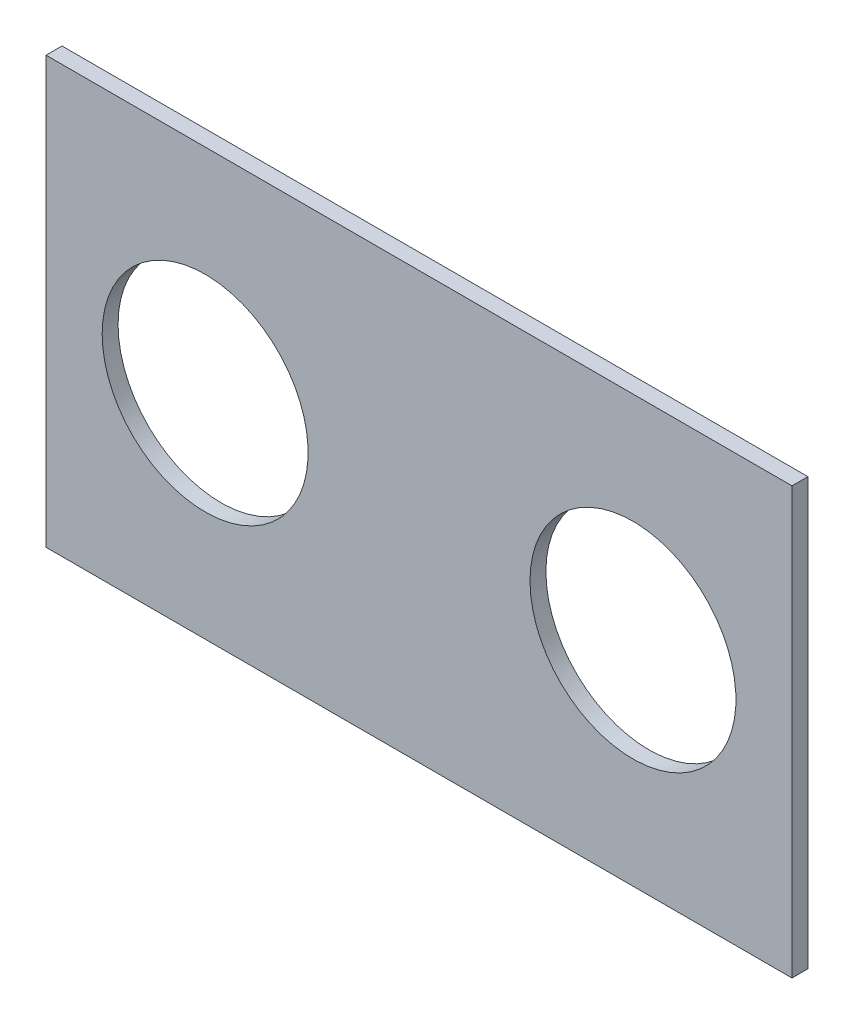
ISO-10303-21;
HEADER;
FILE_DESCRIPTION(('STEP AP214'),'2;1');
FILE_NAME('part.step','',(''),(''),'','','');
FILE_SCHEMA(('AUTOMOTIVE_DESIGN { 1 0 10303 214 1 1 1 1 }'));
ENDSEC;
DATA;
#1=APPLICATION_CONTEXT('core data for automotive mechanical design processes');
#2=APPLICATION_PROTOCOL_DEFINITION('international standard','automotive_design',2000,#1);
#3=PRODUCT_CONTEXT('',#1,'mechanical');
#4=PRODUCT('Part','Part','',(#3));
#5=PRODUCT_RELATED_PRODUCT_CATEGORY('part','',(#4));
#6=PRODUCT_DEFINITION_FORMATION('','',#4);
#7=PRODUCT_DEFINITION_CONTEXT('part definition',#1,'design');
#8=PRODUCT_DEFINITION('design','',#6,#7);
#9=PRODUCT_DEFINITION_SHAPE('','',#8);
#10=(LENGTH_UNIT() NAMED_UNIT(*) SI_UNIT(.MILLI.,.METRE.));
#11=(NAMED_UNIT(*) PLANE_ANGLE_UNIT() SI_UNIT($,.RADIAN.));
#12=(NAMED_UNIT(*) SI_UNIT($,.STERADIAN.) SOLID_ANGLE_UNIT());
#13=UNCERTAINTY_MEASURE_WITH_UNIT(LENGTH_MEASURE(1.E-05),#10,'distance_accuracy_value','');
#14=(GEOMETRIC_REPRESENTATION_CONTEXT(3) GLOBAL_UNCERTAINTY_ASSIGNED_CONTEXT((#13)) GLOBAL_UNIT_ASSIGNED_CONTEXT((#10,
#11,#12)) REPRESENTATION_CONTEXT('',''));
#15=CARTESIAN_POINT('',(0.,0.,0.));
#16=DIRECTION('',(0.,0.,1.));
#17=DIRECTION('',(1.,0.,0.));
#18=AXIS2_PLACEMENT_3D('',#15,#16,#17);
#19=CARTESIAN_POINT('',(0.,0.,1.89738));
#20=DIRECTION('',(0.,0.,1.));
#21=DIRECTION('',(1.,0.,0.));
#22=AXIS2_PLACEMENT_3D('',#19,#20,#21);
#23=PLANE('',#22);
#24=CARTESIAN_POINT('',(0.,0.,1.89738));
#25=DIRECTION('',(0.,0.,1.));
#26=DIRECTION('',(1.,0.,0.));
#27=AXIS2_PLACEMENT_3D('',#24,#25,#26);
#28=CIRCLE('',#27,12.2725961538457);
#29=CARTESIAN_POINT('',(-12.2725961538457,0.,1.89738));
#30=VERTEX_POINT('',#29);
#31=EDGE_CURVE('E106',#30,#30,#28,.T.);
#32=ORIENTED_EDGE('',*,*,#31,.F.);
#33=EDGE_LOOP('',(#32));
#34=FACE_BOUND('',#33,.T.);
#35=DIRECTION('',(0.,-1.,0.));
#36=VECTOR('',#35,1.);
#37=CARTESIAN_POINT('',(-18.9547500000005,25.4,1.89738));
#38=LINE('',#37,#36);
#39=CARTESIAN_POINT('',(-18.9547500000005,25.4,1.89738));
#40=VERTEX_POINT('',#39);
#41=CARTESIAN_POINT('',(-18.9547500000005,-25.4,1.89738));
#42=VERTEX_POINT('',#41);
#43=EDGE_CURVE('E91',#40,#42,#38,.T.);
#44=ORIENTED_EDGE('',*,*,#43,.T.);
#45=DIRECTION('',(1.,0.,0.));
#46=VECTOR('',#45,1.);
#47=CARTESIAN_POINT('',(-18.9547500000005,-25.4,1.89738));
#48=LINE('',#47,#46);
#49=CARTESIAN_POINT('',(69.9452499999995,-25.4,1.89738));
#50=VERTEX_POINT('',#49);
#51=EDGE_CURVE('E86',#42,#50,#48,.T.);
#52=ORIENTED_EDGE('',*,*,#51,.T.);
#53=DIRECTION('',(0.,1.,0.));
#54=VECTOR('',#53,1.);
#55=CARTESIAN_POINT('',(69.9452499999995,25.4,1.89738));
#56=LINE('',#55,#54);
#57=CARTESIAN_POINT('',(69.9452499999995,25.4,1.89738));
#58=VERTEX_POINT('',#57);
#59=EDGE_CURVE('E89',#50,#58,#56,.T.);
#60=ORIENTED_EDGE('',*,*,#59,.T.);
#61=DIRECTION('',(-1.,0.,0.));
#62=VECTOR('',#61,1.);
#63=CARTESIAN_POINT('',(-18.9547500000005,25.4,1.89738));
#64=LINE('',#63,#62);
#65=EDGE_CURVE('E56',#58,#40,#64,.T.);
#66=ORIENTED_EDGE('',*,*,#65,.T.);
#67=EDGE_LOOP('',(#44,#52,#60,#66));
#68=FACE_BOUND('',#67,.T.);
#69=CARTESIAN_POINT('',(50.9905000000007,0.,1.89738));
#70=DIRECTION('',(0.,0.,1.));
#71=DIRECTION('',(1.,0.,0.));
#72=AXIS2_PLACEMENT_3D('',#69,#70,#71);
#73=CIRCLE('',#72,12.2725961538455);
#74=CARTESIAN_POINT('',(38.7179038461552,0.,1.89738));
#75=VERTEX_POINT('',#74);
#76=EDGE_CURVE('E121',#75,#75,#73,.T.);
#77=ORIENTED_EDGE('',*,*,#76,.F.);
#78=EDGE_LOOP('',(#77));
#79=FACE_BOUND('',#78,.T.);
#80=ADVANCED_FACE('F39',(#34,#68,#79),#23,.T.);
#81=CARTESIAN_POINT('',(0.,0.,0.));
#82=DIRECTION('',(0.,0.,1.));
#83=DIRECTION('',(1.,0.,0.));
#84=AXIS2_PLACEMENT_3D('',#81,#82,#83);
#85=PLANE('',#84);
#86=DIRECTION('',(0.,-1.,0.));
#87=VECTOR('',#86,1.);
#88=CARTESIAN_POINT('',(-18.9547500000005,25.4,0.));
#89=LINE('',#88,#87);
#90=CARTESIAN_POINT('',(-18.9547500000005,25.4,0.));
#91=VERTEX_POINT('',#90);
#92=CARTESIAN_POINT('',(-18.9547500000005,-25.4,0.));
#93=VERTEX_POINT('',#92);
#94=EDGE_CURVE('E103',#91,#93,#89,.T.);
#95=ORIENTED_EDGE('',*,*,#94,.F.);
#96=DIRECTION('',(-1.,0.,0.));
#97=VECTOR('',#96,1.);
#98=CARTESIAN_POINT('',(-18.9547500000005,25.4,0.));
#99=LINE('',#98,#97);
#100=CARTESIAN_POINT('',(69.9452499999995,25.4,0.));
#101=VERTEX_POINT('',#100);
#102=EDGE_CURVE('E79',#101,#91,#99,.T.);
#103=ORIENTED_EDGE('',*,*,#102,.F.);
#104=DIRECTION('',(0.,1.,0.));
#105=VECTOR('',#104,1.);
#106=CARTESIAN_POINT('',(69.9452499999995,25.4,0.));
#107=LINE('',#106,#105);
#108=CARTESIAN_POINT('',(69.9452499999995,-25.4,0.));
#109=VERTEX_POINT('',#108);
#110=EDGE_CURVE('E73',#109,#101,#107,.T.);
#111=ORIENTED_EDGE('',*,*,#110,.F.);
#112=DIRECTION('',(1.,0.,0.));
#113=VECTOR('',#112,1.);
#114=CARTESIAN_POINT('',(-18.9547500000005,-25.4,0.));
#115=LINE('',#114,#113);
#116=EDGE_CURVE('E95',#93,#109,#115,.T.);
#117=ORIENTED_EDGE('',*,*,#116,.F.);
#118=EDGE_LOOP('',(#95,#103,#111,#117));
#119=FACE_BOUND('',#118,.T.);
#120=CARTESIAN_POINT('',(0.,0.,0.));
#121=DIRECTION('',(0.,0.,1.));
#122=DIRECTION('',(1.,0.,0.));
#123=AXIS2_PLACEMENT_3D('',#120,#121,#122);
#124=CIRCLE('',#123,12.2725961538457);
#125=CARTESIAN_POINT('',(-12.2725961538457,0.,0.));
#126=VERTEX_POINT('',#125);
#127=EDGE_CURVE('E118',#126,#126,#124,.T.);
#128=ORIENTED_EDGE('',*,*,#127,.T.);
#129=EDGE_LOOP('',(#128));
#130=FACE_BOUND('',#129,.T.);
#131=CARTESIAN_POINT('',(50.9905000000007,0.,0.));
#132=DIRECTION('',(0.,0.,1.));
#133=DIRECTION('',(1.,0.,0.));
#134=AXIS2_PLACEMENT_3D('',#131,#132,#133);
#135=CIRCLE('',#134,12.2725961538455);
#136=CARTESIAN_POINT('',(38.7179038461552,0.,0.));
#137=VERTEX_POINT('',#136);
#138=EDGE_CURVE('E124',#137,#137,#135,.T.);
#139=ORIENTED_EDGE('',*,*,#138,.T.);
#140=EDGE_LOOP('',(#139));
#141=FACE_BOUND('',#140,.T.);
#142=ADVANCED_FACE('F114',(#119,#130,#141),#85,.F.);
#143=CARTESIAN_POINT('',(-18.9547500000005,25.4,1.89738));
#144=DIRECTION('',(1.,0.,0.));
#145=DIRECTION('',(0.,0.,-1.));
#146=AXIS2_PLACEMENT_3D('',#143,#144,#145);
#147=PLANE('',#146);
#148=ORIENTED_EDGE('',*,*,#94,.T.);
#149=DIRECTION('',(0.,0.,-1.));
#150=VECTOR('',#149,1.);
#151=CARTESIAN_POINT('',(-18.9547500000005,-25.4,1.89738));
#152=LINE('',#151,#150);
#153=EDGE_CURVE('E11',#42,#93,#152,.T.);
#154=ORIENTED_EDGE('',*,*,#153,.F.);
#155=ORIENTED_EDGE('',*,*,#43,.F.);
#156=DIRECTION('',(0.,0.,-1.));
#157=VECTOR('',#156,1.);
#158=CARTESIAN_POINT('',(-18.9547500000005,25.4,1.89738));
#159=LINE('',#158,#157);
#160=EDGE_CURVE('E99',#40,#91,#159,.T.);
#161=ORIENTED_EDGE('',*,*,#160,.T.);
#162=EDGE_LOOP('',(#148,#154,#155,#161));
#163=FACE_BOUND('',#162,.T.);
#164=ADVANCED_FACE('F41',(#163),#147,.F.);
#165=CARTESIAN_POINT('',(-18.9547500000005,-25.4,1.89738));
#166=DIRECTION('',(0.,1.,0.));
#167=DIRECTION('',(0.,0.,1.));
#168=AXIS2_PLACEMENT_3D('',#165,#166,#167);
#169=PLANE('',#168);
#170=ORIENTED_EDGE('',*,*,#116,.T.);
#171=DIRECTION('',(0.,0.,-1.));
#172=VECTOR('',#171,1.);
#173=CARTESIAN_POINT('',(69.9452499999995,-25.4,1.89738));
#174=LINE('',#173,#172);
#175=EDGE_CURVE('E48',#50,#109,#174,.T.);
#176=ORIENTED_EDGE('',*,*,#175,.F.);
#177=ORIENTED_EDGE('',*,*,#51,.F.);
#178=ORIENTED_EDGE('',*,*,#153,.T.);
#179=EDGE_LOOP('',(#170,#176,#177,#178));
#180=FACE_BOUND('',#179,.T.);
#181=ADVANCED_FACE('F94',(#180),#169,.F.);
#182=CARTESIAN_POINT('',(69.9452499999995,25.4,1.89738));
#183=DIRECTION('',(-1.,0.,0.));
#184=DIRECTION('',(0.,0.,1.));
#185=AXIS2_PLACEMENT_3D('',#182,#183,#184);
#186=PLANE('',#185);
#187=ORIENTED_EDGE('',*,*,#110,.T.);
#188=DIRECTION('',(0.,0.,-1.));
#189=VECTOR('',#188,1.);
#190=CARTESIAN_POINT('',(69.9452499999995,25.4,1.89738));
#191=LINE('',#190,#189);
#192=EDGE_CURVE('E96',#58,#101,#191,.T.);
#193=ORIENTED_EDGE('',*,*,#192,.F.);
#194=ORIENTED_EDGE('',*,*,#59,.F.);
#195=ORIENTED_EDGE('',*,*,#175,.T.);
#196=EDGE_LOOP('',(#187,#193,#194,#195));
#197=FACE_BOUND('',#196,.T.);
#198=ADVANCED_FACE('F97',(#197),#186,.F.);
#199=CARTESIAN_POINT('',(-18.9547500000005,25.4,1.89738));
#200=DIRECTION('',(0.,-1.,0.));
#201=DIRECTION('',(0.,0.,-1.));
#202=AXIS2_PLACEMENT_3D('',#199,#200,#201);
#203=PLANE('',#202);
#204=ORIENTED_EDGE('',*,*,#102,.T.);
#205=ORIENTED_EDGE('',*,*,#160,.F.);
#206=ORIENTED_EDGE('',*,*,#65,.F.);
#207=ORIENTED_EDGE('',*,*,#192,.T.);
#208=EDGE_LOOP('',(#204,#205,#206,#207));
#209=FACE_BOUND('',#208,.T.);
#210=ADVANCED_FACE('F111',(#209),#203,.F.);
#211=CARTESIAN_POINT('',(0.,0.,1.89738));
#212=DIRECTION('',(0.,0.,-1.));
#213=DIRECTION('',(-1.,0.,0.));
#214=AXIS2_PLACEMENT_3D('',#211,#212,#213);
#215=CYLINDRICAL_SURFACE('',#214,12.2725961538457);
#216=CARTESIAN_POINT('',(-12.2725961538457,0.,1.89738));
#217=CARTESIAN_POINT('',(-12.2725961538457,0.,1.877615625));
#218=CARTESIAN_POINT('',(-12.2725961538457,0.,1.85785125));
#219=CARTESIAN_POINT('',(-12.2725961538457,0.,1.8183225));
#220=CARTESIAN_POINT('',(-12.2725961538457,0.,1.798558125));
#221=CARTESIAN_POINT('',(-12.2725961538457,0.,1.759029375));
#222=CARTESIAN_POINT('',(-12.2725961538457,0.,1.739265));
#223=CARTESIAN_POINT('',(-12.2725961538457,0.,1.69973625));
#224=CARTESIAN_POINT('',(-12.2725961538457,0.,1.679971875));
#225=CARTESIAN_POINT('',(-12.2725961538457,0.,1.640443125));
#226=CARTESIAN_POINT('',(-12.2725961538457,0.,1.62067875));
#227=CARTESIAN_POINT('',(-12.2725961538457,0.,1.58115));
#228=CARTESIAN_POINT('',(-12.2725961538457,0.,1.561385625));
#229=CARTESIAN_POINT('',(-12.2725961538457,0.,1.521856875));
#230=CARTESIAN_POINT('',(-12.2725961538457,0.,1.5020925));
#231=CARTESIAN_POINT('',(-12.2725961538457,0.,1.46256375));
#232=CARTESIAN_POINT('',(-12.2725961538457,0.,1.442799375));
#233=CARTESIAN_POINT('',(-12.2725961538457,0.,1.403270625));
#234=CARTESIAN_POINT('',(-12.2725961538457,0.,1.38350625));
#235=CARTESIAN_POINT('',(-12.2725961538457,0.,1.3439775));
#236=CARTESIAN_POINT('',(-12.2725961538457,0.,1.324213125));
#237=CARTESIAN_POINT('',(-12.2725961538457,0.,1.284684375));
#238=CARTESIAN_POINT('',(-12.2725961538457,0.,1.26492));
#239=CARTESIAN_POINT('',(-12.2725961538457,0.,1.22539125));
#240=CARTESIAN_POINT('',(-12.2725961538457,0.,1.205626875));
#241=CARTESIAN_POINT('',(-12.2725961538457,0.,1.166098125));
#242=CARTESIAN_POINT('',(-12.2725961538457,0.,1.14633375));
#243=CARTESIAN_POINT('',(-12.2725961538457,0.,1.106805));
#244=CARTESIAN_POINT('',(-12.2725961538457,0.,1.087040625));
#245=CARTESIAN_POINT('',(-12.2725961538457,0.,1.047511875));
#246=CARTESIAN_POINT('',(-12.2725961538457,0.,1.0277475));
#247=CARTESIAN_POINT('',(-12.2725961538457,0.,0.98821875));
#248=CARTESIAN_POINT('',(-12.2725961538457,0.,0.968454375));
#249=CARTESIAN_POINT('',(-12.2725961538457,0.,0.928925625));
#250=CARTESIAN_POINT('',(-12.2725961538457,0.,0.90916125));
#251=CARTESIAN_POINT('',(-12.2725961538457,0.,0.8696325));
#252=CARTESIAN_POINT('',(-12.2725961538457,0.,0.849868125));
#253=CARTESIAN_POINT('',(-12.2725961538457,0.,0.810339375));
#254=CARTESIAN_POINT('',(-12.2725961538457,0.,0.790575));
#255=CARTESIAN_POINT('',(-12.2725961538457,0.,0.75104625));
#256=CARTESIAN_POINT('',(-12.2725961538457,0.,0.731281875));
#257=CARTESIAN_POINT('',(-12.2725961538457,0.,0.691753125));
#258=CARTESIAN_POINT('',(-12.2725961538457,0.,0.67198875));
#259=CARTESIAN_POINT('',(-12.2725961538457,0.,0.63246));
#260=CARTESIAN_POINT('',(-12.2725961538457,0.,0.612695625));
#261=CARTESIAN_POINT('',(-12.2725961538457,0.,0.573166875));
#262=CARTESIAN_POINT('',(-12.2725961538457,0.,0.5534025));
#263=CARTESIAN_POINT('',(-12.2725961538457,0.,0.51387375));
#264=CARTESIAN_POINT('',(-12.2725961538457,0.,0.494109375));
#265=CARTESIAN_POINT('',(-12.2725961538457,0.,0.454580625));
#266=CARTESIAN_POINT('',(-12.2725961538457,0.,0.43481625));
#267=CARTESIAN_POINT('',(-12.2725961538457,0.,0.3952875));
#268=CARTESIAN_POINT('',(-12.2725961538457,0.,0.375523125));
#269=CARTESIAN_POINT('',(-12.2725961538457,0.,0.335994375));
#270=CARTESIAN_POINT('',(-12.2725961538457,0.,0.31623));
#271=CARTESIAN_POINT('',(-12.2725961538457,0.,0.27670125));
#272=CARTESIAN_POINT('',(-12.2725961538457,0.,0.256936875));
#273=CARTESIAN_POINT('',(-12.2725961538457,0.,0.217408125));
#274=CARTESIAN_POINT('',(-12.2725961538457,0.,0.19764375));
#275=CARTESIAN_POINT('',(-12.2725961538457,0.,0.158115));
#276=CARTESIAN_POINT('',(-12.2725961538457,0.,0.138350625));
#277=CARTESIAN_POINT('',(-12.2725961538457,0.,0.098821875));
#278=CARTESIAN_POINT('',(-12.2725961538457,0.,0.0790574999999999));
#279=CARTESIAN_POINT('',(-12.2725961538457,0.,0.0395287499999999));
#280=CARTESIAN_POINT('',(-12.2725961538457,0.,0.019764375));
#281=CARTESIAN_POINT('',(-12.2725961538457,0.,0.));
#282=B_SPLINE_CURVE_WITH_KNOTS('',3,(#216,#217,#218,#219,#220,#221,#222,#223,#224,#225,#226,
#227,#228,#229,#230,#231,#232,#233,#234,#235,#236,#237,#238,#239,#240,#241,#242,#243,#244,#245,
#246,#247,#248,#249,#250,#251,#252,#253,#254,#255,#256,#257,#258,#259,#260,#261,#262,#263,#264,
#265,#266,#267,#268,#269,#270,#271,#272,#273,#274,#275,#276,#277,#278,#279,#280,#281),
.UNSPECIFIED.,.F.,.F.,(4,2,2,2,2,2,2,2,2,2,2,2,2,2,2,2,2,2,2,2,2,2,2,2,2,2,2,2,2,2,2,2,4),(0.,
0.0592931250000001,0.11858625,0.177879375,0.2371725,0.296465625,0.35575875,0.415051875,0.474345,
0.533638125,0.59293125,0.652224375,0.7115175,0.770810625,0.83010375,0.889396875,0.94869,
1.007983125,1.06727625,1.126569375,1.1858625,1.245155625,1.30444875,1.363741875,1.423035,
1.482328125,1.54162125,1.600914375,1.6602075,1.719500625,1.77879375,1.838086875,1.89738),.UNSPECIFIED.);
#283=EDGE_CURVE('BSEAM141',#30,#126,#282,.T.);
#284=ORIENTED_EDGE('',*,*,#31,.T.);
#285=ORIENTED_EDGE('',*,*,#127,.F.);
#286=ORIENTED_EDGE('',*,*,#283,.T.);
#287=ORIENTED_EDGE('',*,*,#283,.F.);
#288=EDGE_LOOP('',(#284,#286,#285,#287));
#289=FACE_BOUND('',#288,.T.);
#290=ADVANCED_FACE('F141',(#289),#215,.F.);
#291=CARTESIAN_POINT('',(50.9905000000007,0.,1.89738));
#292=DIRECTION('',(0.,0.,-1.));
#293=DIRECTION('',(-1.,0.,0.));
#294=AXIS2_PLACEMENT_3D('',#291,#292,#293);
#295=CYLINDRICAL_SURFACE('',#294,12.2725961538455);
#296=CARTESIAN_POINT('',(38.7179038461552,0.,1.89738));
#297=CARTESIAN_POINT('',(38.7179038461552,0.,1.877615625));
#298=CARTESIAN_POINT('',(38.7179038461552,0.,1.85785125));
#299=CARTESIAN_POINT('',(38.7179038461552,0.,1.8183225));
#300=CARTESIAN_POINT('',(38.7179038461552,0.,1.798558125));
#301=CARTESIAN_POINT('',(38.7179038461552,0.,1.759029375));
#302=CARTESIAN_POINT('',(38.7179038461552,0.,1.739265));
#303=CARTESIAN_POINT('',(38.7179038461552,0.,1.69973625));
#304=CARTESIAN_POINT('',(38.7179038461552,0.,1.679971875));
#305=CARTESIAN_POINT('',(38.7179038461552,0.,1.640443125));
#306=CARTESIAN_POINT('',(38.7179038461552,0.,1.62067875));
#307=CARTESIAN_POINT('',(38.7179038461552,0.,1.58115));
#308=CARTESIAN_POINT('',(38.7179038461552,0.,1.561385625));
#309=CARTESIAN_POINT('',(38.7179038461552,0.,1.521856875));
#310=CARTESIAN_POINT('',(38.7179038461552,0.,1.5020925));
#311=CARTESIAN_POINT('',(38.7179038461552,0.,1.46256375));
#312=CARTESIAN_POINT('',(38.7179038461552,0.,1.442799375));
#313=CARTESIAN_POINT('',(38.7179038461552,0.,1.403270625));
#314=CARTESIAN_POINT('',(38.7179038461552,0.,1.38350625));
#315=CARTESIAN_POINT('',(38.7179038461552,0.,1.3439775));
#316=CARTESIAN_POINT('',(38.7179038461552,0.,1.324213125));
#317=CARTESIAN_POINT('',(38.7179038461552,0.,1.284684375));
#318=CARTESIAN_POINT('',(38.7179038461552,0.,1.26492));
#319=CARTESIAN_POINT('',(38.7179038461552,0.,1.22539125));
#320=CARTESIAN_POINT('',(38.7179038461552,0.,1.205626875));
#321=CARTESIAN_POINT('',(38.7179038461552,0.,1.166098125));
#322=CARTESIAN_POINT('',(38.7179038461552,0.,1.14633375));
#323=CARTESIAN_POINT('',(38.7179038461552,0.,1.106805));
#324=CARTESIAN_POINT('',(38.7179038461552,0.,1.087040625));
#325=CARTESIAN_POINT('',(38.7179038461552,0.,1.047511875));
#326=CARTESIAN_POINT('',(38.7179038461552,0.,1.0277475));
#327=CARTESIAN_POINT('',(38.7179038461552,0.,0.98821875));
#328=CARTESIAN_POINT('',(38.7179038461552,0.,0.968454375));
#329=CARTESIAN_POINT('',(38.7179038461552,0.,0.928925625));
#330=CARTESIAN_POINT('',(38.7179038461552,0.,0.90916125));
#331=CARTESIAN_POINT('',(38.7179038461552,0.,0.8696325));
#332=CARTESIAN_POINT('',(38.7179038461552,0.,0.849868125));
#333=CARTESIAN_POINT('',(38.7179038461552,0.,0.810339375));
#334=CARTESIAN_POINT('',(38.7179038461552,0.,0.790575));
#335=CARTESIAN_POINT('',(38.7179038461552,0.,0.75104625));
#336=CARTESIAN_POINT('',(38.7179038461552,0.,0.731281875));
#337=CARTESIAN_POINT('',(38.7179038461552,0.,0.691753125));
#338=CARTESIAN_POINT('',(38.7179038461552,0.,0.67198875));
#339=CARTESIAN_POINT('',(38.7179038461552,0.,0.63246));
#340=CARTESIAN_POINT('',(38.7179038461552,0.,0.612695625));
#341=CARTESIAN_POINT('',(38.7179038461552,0.,0.573166875));
#342=CARTESIAN_POINT('',(38.7179038461552,0.,0.5534025));
#343=CARTESIAN_POINT('',(38.7179038461552,0.,0.51387375));
#344=CARTESIAN_POINT('',(38.7179038461552,0.,0.494109375));
#345=CARTESIAN_POINT('',(38.7179038461552,0.,0.454580625));
#346=CARTESIAN_POINT('',(38.7179038461552,0.,0.43481625));
#347=CARTESIAN_POINT('',(38.7179038461552,0.,0.3952875));
#348=CARTESIAN_POINT('',(38.7179038461552,0.,0.375523125));
#349=CARTESIAN_POINT('',(38.7179038461552,0.,0.335994375));
#350=CARTESIAN_POINT('',(38.7179038461552,0.,0.31623));
#351=CARTESIAN_POINT('',(38.7179038461552,0.,0.27670125));
#352=CARTESIAN_POINT('',(38.7179038461552,0.,0.256936875));
#353=CARTESIAN_POINT('',(38.7179038461552,0.,0.217408125));
#354=CARTESIAN_POINT('',(38.7179038461552,0.,0.19764375));
#355=CARTESIAN_POINT('',(38.7179038461552,0.,0.158115));
#356=CARTESIAN_POINT('',(38.7179038461552,0.,0.138350625));
#357=CARTESIAN_POINT('',(38.7179038461552,0.,0.098821875));
#358=CARTESIAN_POINT('',(38.7179038461552,0.,0.0790574999999999));
#359=CARTESIAN_POINT('',(38.7179038461552,0.,0.0395287499999999));
#360=CARTESIAN_POINT('',(38.7179038461552,0.,0.019764375));
#361=CARTESIAN_POINT('',(38.7179038461552,0.,0.));
#362=B_SPLINE_CURVE_WITH_KNOTS('',3,(#296,#297,#298,#299,#300,#301,#302,#303,#304,#305,#306,
#307,#308,#309,#310,#311,#312,#313,#314,#315,#316,#317,#318,#319,#320,#321,#322,#323,#324,#325,
#326,#327,#328,#329,#330,#331,#332,#333,#334,#335,#336,#337,#338,#339,#340,#341,#342,#343,#344,
#345,#346,#347,#348,#349,#350,#351,#352,#353,#354,#355,#356,#357,#358,#359,#360,#361),
.UNSPECIFIED.,.F.,.F.,(4,2,2,2,2,2,2,2,2,2,2,2,2,2,2,2,2,2,2,2,2,2,2,2,2,2,2,2,2,2,2,2,4),(0.,
0.0592931250000001,0.11858625,0.177879375,0.2371725,0.296465625,0.35575875,0.415051875,0.474345,
0.533638125,0.59293125,0.652224375,0.7115175,0.770810625,0.83010375,0.889396875,0.94869,
1.007983125,1.06727625,1.126569375,1.1858625,1.245155625,1.30444875,1.363741875,1.423035,
1.482328125,1.54162125,1.600914375,1.6602075,1.719500625,1.77879375,1.838086875,1.89738),.UNSPECIFIED.);
#363=EDGE_CURVE('BSEAM130',#75,#137,#362,.T.);
#364=ORIENTED_EDGE('',*,*,#76,.T.);
#365=ORIENTED_EDGE('',*,*,#138,.F.);
#366=ORIENTED_EDGE('',*,*,#363,.T.);
#367=ORIENTED_EDGE('',*,*,#363,.F.);
#368=EDGE_LOOP('',(#364,#366,#365,#367));
#369=FACE_BOUND('',#368,.T.);
#370=ADVANCED_FACE('F130',(#369),#295,.F.);
#371=CLOSED_SHELL('',(#80,#142,#164,#181,#198,#210,#290,#370));
#372=MANIFOLD_SOLID_BREP('B2',#371);
#373=ADVANCED_BREP_SHAPE_REPRESENTATION('',(#18,#372),#14);
#374=SHAPE_DEFINITION_REPRESENTATION(#9,#373);
ENDSEC;
END-ISO-10303-21;
